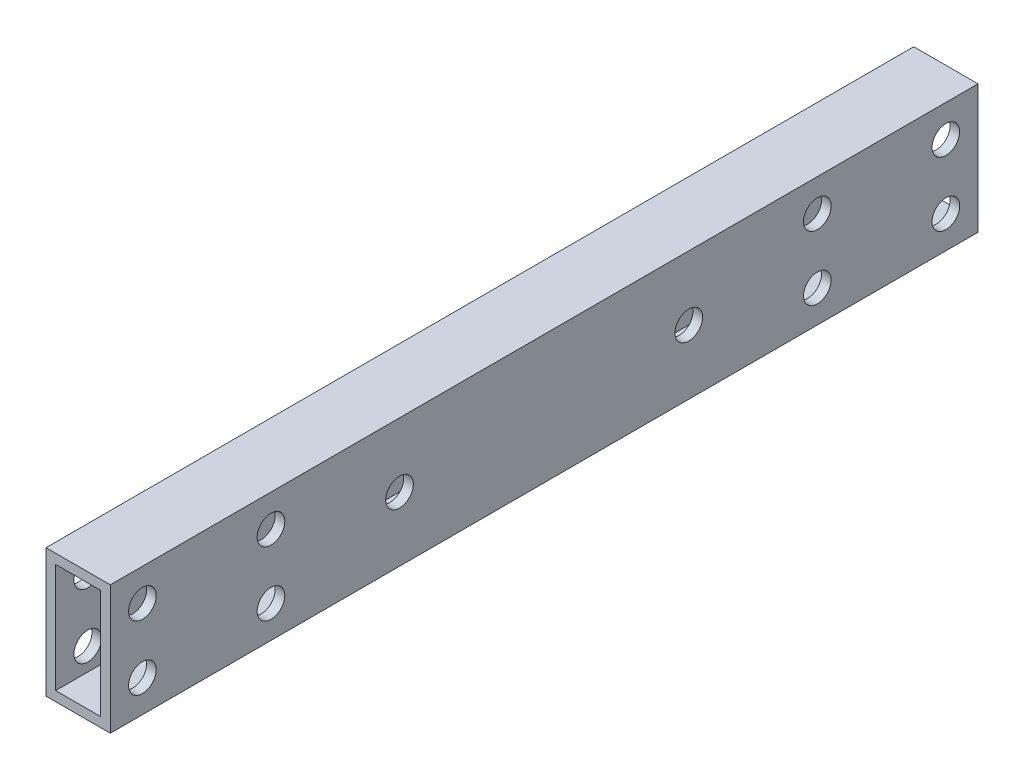
ISO-10303-21;
HEADER;
FILE_DESCRIPTION(('STEP AP214'),'2;1');
FILE_NAME('part.step','',(''),(''),'','','');
FILE_SCHEMA(('AUTOMOTIVE_DESIGN { 1 0 10303 214 1 1 1 1 }'));
ENDSEC;
DATA;
#1=APPLICATION_CONTEXT('core data for automotive mechanical design processes');
#2=APPLICATION_PROTOCOL_DEFINITION('international standard','automotive_design',2000,#1);
#3=PRODUCT_CONTEXT('',#1,'mechanical');
#4=PRODUCT('Part','Part','',(#3));
#5=PRODUCT_RELATED_PRODUCT_CATEGORY('part','',(#4));
#6=PRODUCT_DEFINITION_FORMATION('','',#4);
#7=PRODUCT_DEFINITION_CONTEXT('part definition',#1,'design');
#8=PRODUCT_DEFINITION('design','',#6,#7);
#9=PRODUCT_DEFINITION_SHAPE('','',#8);
#10=(LENGTH_UNIT() NAMED_UNIT(*) SI_UNIT(.MILLI.,.METRE.));
#11=(NAMED_UNIT(*) PLANE_ANGLE_UNIT() SI_UNIT($,.RADIAN.));
#12=(NAMED_UNIT(*) SI_UNIT($,.STERADIAN.) SOLID_ANGLE_UNIT());
#13=UNCERTAINTY_MEASURE_WITH_UNIT(LENGTH_MEASURE(1.E-05),#10,'distance_accuracy_value','');
#14=(GEOMETRIC_REPRESENTATION_CONTEXT(3) GLOBAL_UNCERTAINTY_ASSIGNED_CONTEXT((#13)) GLOBAL_UNIT_ASSIGNED_CONTEXT((#10,
#11,#12)) REPRESENTATION_CONTEXT('',''));
#15=CARTESIAN_POINT('',(0.,0.,0.));
#16=DIRECTION('',(0.,0.,1.));
#17=DIRECTION('',(1.,0.,0.));
#18=AXIS2_PLACEMENT_3D('',#15,#16,#17);
#19=CARTESIAN_POINT('',(0.,0.,135.));
#20=DIRECTION('',(0.,0.,1.));
#21=DIRECTION('',(1.,0.,0.));
#22=AXIS2_PLACEMENT_3D('',#19,#20,#21);
#23=PLANE('',#22);
#24=DIRECTION('',(0.,-1.,0.));
#25=VECTOR('',#24,1.);
#26=CARTESIAN_POINT('',(0.,0.,135.));
#27=LINE('',#26,#25);
#28=CARTESIAN_POINT('',(0.,20.,135.));
#29=VERTEX_POINT('',#28);
#30=CARTESIAN_POINT('',(0.,0.,135.));
#31=VERTEX_POINT('',#30);
#32=EDGE_CURVE('E166',#29,#31,#27,.T.);
#33=ORIENTED_EDGE('',*,*,#32,.T.);
#34=DIRECTION('',(1.,0.,0.));
#35=VECTOR('',#34,1.);
#36=CARTESIAN_POINT('',(0.,0.,135.));
#37=LINE('',#36,#35);
#38=CARTESIAN_POINT('',(10.,0.,135.));
#39=VERTEX_POINT('',#38);
#40=EDGE_CURVE('E169',#31,#39,#37,.T.);
#41=ORIENTED_EDGE('',*,*,#40,.T.);
#42=DIRECTION('',(0.,1.,0.));
#43=VECTOR('',#42,1.);
#44=CARTESIAN_POINT('',(10.,0.,135.));
#45=LINE('',#44,#43);
#46=CARTESIAN_POINT('',(10.,20.,135.));
#47=VERTEX_POINT('',#46);
#48=EDGE_CURVE('E172',#39,#47,#45,.T.);
#49=ORIENTED_EDGE('',*,*,#48,.T.);
#50=DIRECTION('',(-1.,0.,0.));
#51=VECTOR('',#50,1.);
#52=CARTESIAN_POINT('',(0.,20.,135.));
#53=LINE('',#52,#51);
#54=EDGE_CURVE('E174',#47,#29,#53,.T.);
#55=ORIENTED_EDGE('',*,*,#54,.T.);
#56=EDGE_LOOP('',(#33,#41,#49,#55));
#57=FACE_BOUND('',#56,.T.);
#58=DIRECTION('',(1.,0.,0.));
#59=VECTOR('',#58,1.);
#60=CARTESIAN_POINT('',(0.,1.5,135.));
#61=LINE('',#60,#59);
#62=CARTESIAN_POINT('',(1.5,1.5,135.));
#63=VERTEX_POINT('',#62);
#64=CARTESIAN_POINT('',(8.5,1.5,135.));
#65=VERTEX_POINT('',#64);
#66=EDGE_CURVE('E136',#63,#65,#61,.T.);
#67=ORIENTED_EDGE('',*,*,#66,.F.);
#68=DIRECTION('',(0.,-1.,0.));
#69=VECTOR('',#68,1.);
#70=CARTESIAN_POINT('',(1.5,0.,135.));
#71=LINE('',#70,#69);
#72=CARTESIAN_POINT('',(1.5,18.5,135.));
#73=VERTEX_POINT('',#72);
#74=EDGE_CURVE('E128',#73,#63,#71,.T.);
#75=ORIENTED_EDGE('',*,*,#74,.F.);
#76=DIRECTION('',(-1.,0.,0.));
#77=VECTOR('',#76,1.);
#78=CARTESIAN_POINT('',(0.,18.5,135.));
#79=LINE('',#78,#77);
#80=CARTESIAN_POINT('',(8.5,18.5,135.));
#81=VERTEX_POINT('',#80);
#82=EDGE_CURVE('E150',#81,#73,#79,.T.);
#83=ORIENTED_EDGE('',*,*,#82,.F.);
#84=DIRECTION('',(0.,1.,0.));
#85=VECTOR('',#84,1.);
#86=CARTESIAN_POINT('',(8.5,0.,135.));
#87=LINE('',#86,#85);
#88=EDGE_CURVE('E148',#65,#81,#87,.T.);
#89=ORIENTED_EDGE('',*,*,#88,.F.);
#90=EDGE_LOOP('',(#67,#75,#83,#89));
#91=FACE_BOUND('',#90,.T.);
#92=ADVANCED_FACE('F61',(#57,#91),#23,.T.);
#93=CARTESIAN_POINT('',(0.,0.,0.));
#94=DIRECTION('',(0.,0.,1.));
#95=DIRECTION('',(1.,0.,0.));
#96=AXIS2_PLACEMENT_3D('',#93,#94,#95);
#97=PLANE('',#96);
#98=DIRECTION('',(0.,-1.,0.));
#99=VECTOR('',#98,1.);
#100=CARTESIAN_POINT('',(0.,0.,0.));
#101=LINE('',#100,#99);
#102=CARTESIAN_POINT('',(0.,20.,0.));
#103=VERTEX_POINT('',#102);
#104=CARTESIAN_POINT('',(0.,0.,0.));
#105=VERTEX_POINT('',#104);
#106=EDGE_CURVE('E144',#103,#105,#101,.T.);
#107=ORIENTED_EDGE('',*,*,#106,.F.);
#108=DIRECTION('',(-1.,0.,0.));
#109=VECTOR('',#108,1.);
#110=CARTESIAN_POINT('',(0.,20.,0.));
#111=LINE('',#110,#109);
#112=CARTESIAN_POINT('',(10.,20.,0.));
#113=VERTEX_POINT('',#112);
#114=EDGE_CURVE('E170',#113,#103,#111,.T.);
#115=ORIENTED_EDGE('',*,*,#114,.F.);
#116=DIRECTION('',(0.,1.,0.));
#117=VECTOR('',#116,1.);
#118=CARTESIAN_POINT('',(10.,0.,0.));
#119=LINE('',#118,#117);
#120=CARTESIAN_POINT('',(10.,0.,0.));
#121=VERTEX_POINT('',#120);
#122=EDGE_CURVE('E181',#121,#113,#119,.T.);
#123=ORIENTED_EDGE('',*,*,#122,.F.);
#124=DIRECTION('',(1.,0.,0.));
#125=VECTOR('',#124,1.);
#126=CARTESIAN_POINT('',(0.,0.,0.));
#127=LINE('',#126,#125);
#128=EDGE_CURVE('E179',#105,#121,#127,.T.);
#129=ORIENTED_EDGE('',*,*,#128,.F.);
#130=EDGE_LOOP('',(#107,#115,#123,#129));
#131=FACE_BOUND('',#130,.T.);
#132=DIRECTION('',(0.,-1.,0.));
#133=VECTOR('',#132,1.);
#134=CARTESIAN_POINT('',(1.5,0.,0.));
#135=LINE('',#134,#133);
#136=CARTESIAN_POINT('',(1.5,18.5,0.));
#137=VERTEX_POINT('',#136);
#138=CARTESIAN_POINT('',(1.5,1.5,0.));
#139=VERTEX_POINT('',#138);
#140=EDGE_CURVE('E86',#137,#139,#135,.T.);
#141=ORIENTED_EDGE('',*,*,#140,.T.);
#142=DIRECTION('',(1.,0.,0.));
#143=VECTOR('',#142,1.);
#144=CARTESIAN_POINT('',(0.,1.5,0.));
#145=LINE('',#144,#143);
#146=CARTESIAN_POINT('',(8.5,1.5,0.));
#147=VERTEX_POINT('',#146);
#148=EDGE_CURVE('E143',#139,#147,#145,.T.);
#149=ORIENTED_EDGE('',*,*,#148,.T.);
#150=DIRECTION('',(0.,1.,0.));
#151=VECTOR('',#150,1.);
#152=CARTESIAN_POINT('',(8.5,0.,0.));
#153=LINE('',#152,#151);
#154=CARTESIAN_POINT('',(8.5,18.5,0.));
#155=VERTEX_POINT('',#154);
#156=EDGE_CURVE('E158',#147,#155,#153,.T.);
#157=ORIENTED_EDGE('',*,*,#156,.T.);
#158=DIRECTION('',(-1.,0.,0.));
#159=VECTOR('',#158,1.);
#160=CARTESIAN_POINT('',(0.,18.5,0.));
#161=LINE('',#160,#159);
#162=EDGE_CURVE('E137',#155,#137,#161,.T.);
#163=ORIENTED_EDGE('',*,*,#162,.T.);
#164=EDGE_LOOP('',(#141,#149,#157,#163));
#165=FACE_BOUND('',#164,.T.);
#166=ADVANCED_FACE('F269',(#131,#165),#97,.F.);
#167=CARTESIAN_POINT('',(0.,0.,135.));
#168=DIRECTION('',(1.,0.,0.));
#169=DIRECTION('',(0.,0.,-1.));
#170=AXIS2_PLACEMENT_3D('',#167,#168,#169);
#171=PLANE('',#170);
#172=CARTESIAN_POINT('',(0.,5.,130.));
#173=DIRECTION('',(1.,0.,0.));
#174=DIRECTION('',(0.,0.,-1.));
#175=AXIS2_PLACEMENT_3D('',#172,#173,#174);
#176=CIRCLE('',#175,2.15000000000002);
#177=CARTESIAN_POINT('',(0.,5.,127.85));
#178=VERTEX_POINT('',#177);
#179=EDGE_CURVE('E322',#178,#178,#176,.F.);
#180=ORIENTED_EDGE('',*,*,#179,.F.);
#181=EDGE_LOOP('',(#180));
#182=FACE_BOUND('',#181,.T.);
#183=CARTESIAN_POINT('',(0.,5.,110.));
#184=DIRECTION('',(1.,0.,0.));
#185=DIRECTION('',(0.,0.,-1.));
#186=AXIS2_PLACEMENT_3D('',#183,#184,#185);
#187=CIRCLE('',#186,2.15000000000002);
#188=CARTESIAN_POINT('',(0.,5.,107.85));
#189=VERTEX_POINT('',#188);
#190=EDGE_CURVE('E326',#189,#189,#187,.F.);
#191=ORIENTED_EDGE('',*,*,#190,.F.);
#192=EDGE_LOOP('',(#191));
#193=FACE_BOUND('',#192,.T.);
#194=CARTESIAN_POINT('',(0.,15.,5.));
#195=DIRECTION('',(1.,0.,0.));
#196=DIRECTION('',(0.,0.,-1.));
#197=AXIS2_PLACEMENT_3D('',#194,#195,#196);
#198=CIRCLE('',#197,2.15000000000002);
#199=CARTESIAN_POINT('',(0.,15.,2.84999999999999));
#200=VERTEX_POINT('',#199);
#201=EDGE_CURVE('E330',#200,#200,#198,.F.);
#202=ORIENTED_EDGE('',*,*,#201,.F.);
#203=EDGE_LOOP('',(#202));
#204=FACE_BOUND('',#203,.T.);
#205=CARTESIAN_POINT('',(0.,15.,25.));
#206=DIRECTION('',(1.,0.,0.));
#207=DIRECTION('',(0.,0.,-1.));
#208=AXIS2_PLACEMENT_3D('',#205,#206,#207);
#209=CIRCLE('',#208,2.15000000000002);
#210=CARTESIAN_POINT('',(0.,15.,22.85));
#211=VERTEX_POINT('',#210);
#212=EDGE_CURVE('E334',#211,#211,#209,.F.);
#213=ORIENTED_EDGE('',*,*,#212,.F.);
#214=EDGE_LOOP('',(#213));
#215=FACE_BOUND('',#214,.T.);
#216=CARTESIAN_POINT('',(0.,5.00000000000002,25.));
#217=DIRECTION('',(1.,0.,0.));
#218=DIRECTION('',(0.,0.,-1.));
#219=AXIS2_PLACEMENT_3D('',#216,#217,#218);
#220=CIRCLE('',#219,2.15000000000002);
#221=CARTESIAN_POINT('',(0.,5.00000000000002,22.85));
#222=VERTEX_POINT('',#221);
#223=EDGE_CURVE('E338',#222,#222,#220,.F.);
#224=ORIENTED_EDGE('',*,*,#223,.F.);
#225=EDGE_LOOP('',(#224));
#226=FACE_BOUND('',#225,.T.);
#227=CARTESIAN_POINT('',(0.,5.00000000000002,5.));
#228=DIRECTION('',(1.,0.,0.));
#229=DIRECTION('',(0.,0.,-1.));
#230=AXIS2_PLACEMENT_3D('',#227,#228,#229);
#231=CIRCLE('',#230,2.15000000000002);
#232=CARTESIAN_POINT('',(0.,5.00000000000002,2.84999999999999));
#233=VERTEX_POINT('',#232);
#234=EDGE_CURVE('E342',#233,#233,#231,.F.);
#235=ORIENTED_EDGE('',*,*,#234,.F.);
#236=EDGE_LOOP('',(#235));
#237=FACE_BOUND('',#236,.T.);
#238=CARTESIAN_POINT('',(0.,10.,45.));
#239=DIRECTION('',(1.,0.,0.));
#240=DIRECTION('',(0.,0.,-1.));
#241=AXIS2_PLACEMENT_3D('',#238,#239,#240);
#242=CIRCLE('',#241,2.15);
#243=CARTESIAN_POINT('',(0.,10.,42.85));
#244=VERTEX_POINT('',#243);
#245=EDGE_CURVE('E346',#244,#244,#242,.F.);
#246=ORIENTED_EDGE('',*,*,#245,.F.);
#247=EDGE_LOOP('',(#246));
#248=FACE_BOUND('',#247,.T.);
#249=CARTESIAN_POINT('',(0.,15.,110.));
#250=DIRECTION('',(1.,0.,0.));
#251=DIRECTION('',(0.,0.,-1.));
#252=AXIS2_PLACEMENT_3D('',#249,#250,#251);
#253=CIRCLE('',#252,2.15000000000002);
#254=CARTESIAN_POINT('',(0.,15.,107.85));
#255=VERTEX_POINT('',#254);
#256=EDGE_CURVE('E350',#255,#255,#253,.F.);
#257=ORIENTED_EDGE('',*,*,#256,.F.);
#258=EDGE_LOOP('',(#257));
#259=FACE_BOUND('',#258,.T.);
#260=CARTESIAN_POINT('',(0.,9.99999999999999,90.));
#261=DIRECTION('',(1.,0.,0.));
#262=DIRECTION('',(0.,0.,-1.));
#263=AXIS2_PLACEMENT_3D('',#260,#261,#262);
#264=CIRCLE('',#263,2.15);
#265=CARTESIAN_POINT('',(0.,9.99999999999999,87.85));
#266=VERTEX_POINT('',#265);
#267=EDGE_CURVE('E354',#266,#266,#264,.F.);
#268=ORIENTED_EDGE('',*,*,#267,.F.);
#269=EDGE_LOOP('',(#268));
#270=FACE_BOUND('',#269,.T.);
#271=CARTESIAN_POINT('',(0.,15.,130.));
#272=DIRECTION('',(1.,0.,0.));
#273=DIRECTION('',(0.,0.,-1.));
#274=AXIS2_PLACEMENT_3D('',#271,#272,#273);
#275=CIRCLE('',#274,2.15000000000002);
#276=CARTESIAN_POINT('',(0.,15.,127.85));
#277=VERTEX_POINT('',#276);
#278=EDGE_CURVE('E195',#277,#277,#275,.F.);
#279=ORIENTED_EDGE('',*,*,#278,.F.);
#280=EDGE_LOOP('',(#279));
#281=FACE_BOUND('',#280,.T.);
#282=ORIENTED_EDGE('',*,*,#106,.T.);
#283=DIRECTION('',(0.,0.,-1.));
#284=VECTOR('',#283,1.);
#285=CARTESIAN_POINT('',(0.,0.,135.));
#286=LINE('',#285,#284);
#287=EDGE_CURVE('E12',#31,#105,#286,.T.);
#288=ORIENTED_EDGE('',*,*,#287,.F.);
#289=ORIENTED_EDGE('',*,*,#32,.F.);
#290=DIRECTION('',(0.,0.,-1.));
#291=VECTOR('',#290,1.);
#292=CARTESIAN_POINT('',(0.,20.,135.));
#293=LINE('',#292,#291);
#294=EDGE_CURVE('E176',#29,#103,#293,.T.);
#295=ORIENTED_EDGE('',*,*,#294,.T.);
#296=EDGE_LOOP('',(#282,#288,#289,#295));
#297=FACE_BOUND('',#296,.T.);
#298=ADVANCED_FACE('F63',(#182,#193,#204,#215,#226,#237,#248,#259,#270,#281,#297),#171,.F.);
#299=CARTESIAN_POINT('',(0.,0.,135.));
#300=DIRECTION('',(0.,1.,0.));
#301=DIRECTION('',(0.,0.,1.));
#302=AXIS2_PLACEMENT_3D('',#299,#300,#301);
#303=PLANE('',#302);
#304=ORIENTED_EDGE('',*,*,#128,.T.);
#305=DIRECTION('',(0.,0.,-1.));
#306=VECTOR('',#305,1.);
#307=CARTESIAN_POINT('',(10.,0.,135.));
#308=LINE('',#307,#306);
#309=EDGE_CURVE('E70',#39,#121,#308,.T.);
#310=ORIENTED_EDGE('',*,*,#309,.F.);
#311=ORIENTED_EDGE('',*,*,#40,.F.);
#312=ORIENTED_EDGE('',*,*,#287,.T.);
#313=EDGE_LOOP('',(#304,#310,#311,#312));
#314=FACE_BOUND('',#313,.T.);
#315=ADVANCED_FACE('F297',(#314),#303,.F.);
#316=CARTESIAN_POINT('',(10.,0.,135.));
#317=DIRECTION('',(-1.,0.,0.));
#318=DIRECTION('',(0.,0.,1.));
#319=AXIS2_PLACEMENT_3D('',#316,#317,#318);
#320=PLANE('',#319);
#321=CARTESIAN_POINT('',(10.,5.,130.));
#322=DIRECTION('',(1.,0.,0.));
#323=DIRECTION('',(0.,0.,1.));
#324=AXIS2_PLACEMENT_3D('',#321,#322,#323);
#325=CIRCLE('',#324,2.15000000000002);
#326=CARTESIAN_POINT('',(10.,5.,132.15));
#327=VERTEX_POINT('',#326);
#328=EDGE_CURVE('E445',#327,#327,#325,.T.);
#329=ORIENTED_EDGE('',*,*,#328,.F.);
#330=EDGE_LOOP('',(#329));
#331=FACE_BOUND('',#330,.T.);
#332=CARTESIAN_POINT('',(10.,5.,110.));
#333=DIRECTION('',(1.,0.,0.));
#334=DIRECTION('',(0.,0.,1.));
#335=AXIS2_PLACEMENT_3D('',#332,#333,#334);
#336=CIRCLE('',#335,2.15000000000002);
#337=CARTESIAN_POINT('',(10.,5.,112.15));
#338=VERTEX_POINT('',#337);
#339=EDGE_CURVE('E457',#338,#338,#336,.T.);
#340=ORIENTED_EDGE('',*,*,#339,.F.);
#341=EDGE_LOOP('',(#340));
#342=FACE_BOUND('',#341,.T.);
#343=CARTESIAN_POINT('',(10.,15.,5.));
#344=DIRECTION('',(1.,0.,0.));
#345=DIRECTION('',(0.,0.,1.));
#346=AXIS2_PLACEMENT_3D('',#343,#344,#345);
#347=CIRCLE('',#346,2.15000000000002);
#348=CARTESIAN_POINT('',(10.,15.,7.15000000000002));
#349=VERTEX_POINT('',#348);
#350=EDGE_CURVE('E453',#349,#349,#347,.T.);
#351=ORIENTED_EDGE('',*,*,#350,.F.);
#352=EDGE_LOOP('',(#351));
#353=FACE_BOUND('',#352,.T.);
#354=CARTESIAN_POINT('',(10.,15.,25.));
#355=DIRECTION('',(1.,0.,0.));
#356=DIRECTION('',(0.,0.,1.));
#357=AXIS2_PLACEMENT_3D('',#354,#355,#356);
#358=CIRCLE('',#357,2.15000000000002);
#359=CARTESIAN_POINT('',(10.,15.,27.15));
#360=VERTEX_POINT('',#359);
#361=EDGE_CURVE('E448',#360,#360,#358,.T.);
#362=ORIENTED_EDGE('',*,*,#361,.F.);
#363=EDGE_LOOP('',(#362));
#364=FACE_BOUND('',#363,.T.);
#365=CARTESIAN_POINT('',(10.,5.00000000000002,25.));
#366=DIRECTION('',(1.,0.,0.));
#367=DIRECTION('',(0.,0.,-1.));
#368=AXIS2_PLACEMENT_3D('',#365,#366,#367);
#369=CIRCLE('',#368,2.15000000000002);
#370=CARTESIAN_POINT('',(10.,5.00000000000002,22.85));
#371=VERTEX_POINT('',#370);
#372=EDGE_CURVE('E452',#371,#371,#369,.T.);
#373=ORIENTED_EDGE('',*,*,#372,.F.);
#374=EDGE_LOOP('',(#373));
#375=FACE_BOUND('',#374,.T.);
#376=CARTESIAN_POINT('',(10.,5.00000000000002,5.));
#377=DIRECTION('',(1.,0.,0.));
#378=DIRECTION('',(0.,0.,-1.));
#379=AXIS2_PLACEMENT_3D('',#376,#377,#378);
#380=CIRCLE('',#379,2.15000000000002);
#381=CARTESIAN_POINT('',(10.,5.00000000000002,2.84999999999999));
#382=VERTEX_POINT('',#381);
#383=EDGE_CURVE('E472',#382,#382,#380,.T.);
#384=ORIENTED_EDGE('',*,*,#383,.F.);
#385=EDGE_LOOP('',(#384));
#386=FACE_BOUND('',#385,.T.);
#387=CARTESIAN_POINT('',(10.,10.,45.));
#388=DIRECTION('',(1.,0.,0.));
#389=DIRECTION('',(0.,0.,-1.));
#390=AXIS2_PLACEMENT_3D('',#387,#388,#389);
#391=CIRCLE('',#390,2.15);
#392=CARTESIAN_POINT('',(10.,10.,42.85));
#393=VERTEX_POINT('',#392);
#394=EDGE_CURVE('E468',#393,#393,#391,.T.);
#395=ORIENTED_EDGE('',*,*,#394,.F.);
#396=EDGE_LOOP('',(#395));
#397=FACE_BOUND('',#396,.T.);
#398=CARTESIAN_POINT('',(10.,15.,110.));
#399=DIRECTION('',(1.,0.,0.));
#400=DIRECTION('',(0.,0.,-1.));
#401=AXIS2_PLACEMENT_3D('',#398,#399,#400);
#402=CIRCLE('',#401,2.15000000000002);
#403=CARTESIAN_POINT('',(10.,15.,107.85));
#404=VERTEX_POINT('',#403);
#405=EDGE_CURVE('E464',#404,#404,#402,.T.);
#406=ORIENTED_EDGE('',*,*,#405,.F.);
#407=EDGE_LOOP('',(#406));
#408=FACE_BOUND('',#407,.T.);
#409=CARTESIAN_POINT('',(10.,9.99999999999999,90.));
#410=DIRECTION('',(1.,0.,0.));
#411=DIRECTION('',(0.,0.,1.));
#412=AXIS2_PLACEMENT_3D('',#409,#410,#411);
#413=CIRCLE('',#412,2.15);
#414=CARTESIAN_POINT('',(10.,9.99999999999999,92.15));
#415=VERTEX_POINT('',#414);
#416=EDGE_CURVE('E442',#415,#415,#413,.T.);
#417=ORIENTED_EDGE('',*,*,#416,.F.);
#418=EDGE_LOOP('',(#417));
#419=FACE_BOUND('',#418,.T.);
#420=CARTESIAN_POINT('',(10.,15.,130.));
#421=DIRECTION('',(1.,0.,0.));
#422=DIRECTION('',(0.,0.,-1.));
#423=AXIS2_PLACEMENT_3D('',#420,#421,#422);
#424=CIRCLE('',#423,2.15000000000002);
#425=CARTESIAN_POINT('',(10.,15.,127.85));
#426=VERTEX_POINT('',#425);
#427=EDGE_CURVE('E358',#426,#426,#424,.T.);
#428=ORIENTED_EDGE('',*,*,#427,.F.);
#429=EDGE_LOOP('',(#428));
#430=FACE_BOUND('',#429,.T.);
#431=ORIENTED_EDGE('',*,*,#122,.T.);
#432=DIRECTION('',(0.,0.,-1.));
#433=VECTOR('',#432,1.);
#434=CARTESIAN_POINT('',(10.,20.,135.));
#435=LINE('',#434,#433);
#436=EDGE_CURVE('E186',#47,#113,#435,.T.);
#437=ORIENTED_EDGE('',*,*,#436,.F.);
#438=ORIENTED_EDGE('',*,*,#48,.F.);
#439=ORIENTED_EDGE('',*,*,#309,.T.);
#440=EDGE_LOOP('',(#431,#437,#438,#439));
#441=FACE_BOUND('',#440,.T.);
#442=ADVANCED_FACE('F294',(#331,#342,#353,#364,#375,#386,#397,#408,#419,#430,#441),#320,.F.);
#443=CARTESIAN_POINT('',(0.,20.,135.));
#444=DIRECTION('',(0.,-1.,0.));
#445=DIRECTION('',(0.,0.,-1.));
#446=AXIS2_PLACEMENT_3D('',#443,#444,#445);
#447=PLANE('',#446);
#448=ORIENTED_EDGE('',*,*,#114,.T.);
#449=ORIENTED_EDGE('',*,*,#294,.F.);
#450=ORIENTED_EDGE('',*,*,#54,.F.);
#451=ORIENTED_EDGE('',*,*,#436,.T.);
#452=EDGE_LOOP('',(#448,#449,#450,#451));
#453=FACE_BOUND('',#452,.T.);
#454=ADVANCED_FACE('F291',(#453),#447,.F.);
#455=CARTESIAN_POINT('',(1.5,0.,135.));
#456=DIRECTION('',(1.,0.,0.));
#457=DIRECTION('',(0.,0.,-1.));
#458=AXIS2_PLACEMENT_3D('',#455,#456,#457);
#459=PLANE('',#458);
#460=CARTESIAN_POINT('',(1.5,5.,130.));
#461=DIRECTION('',(1.,0.,0.));
#462=DIRECTION('',(0.,0.,-1.));
#463=AXIS2_PLACEMENT_3D('',#460,#461,#462);
#464=CIRCLE('',#463,2.15000000000002);
#465=CARTESIAN_POINT('',(1.5,5.,127.85));
#466=VERTEX_POINT('',#465);
#467=EDGE_CURVE('E156',#466,#466,#464,.T.);
#468=ORIENTED_EDGE('',*,*,#467,.F.);
#469=EDGE_LOOP('',(#468));
#470=FACE_BOUND('',#469,.T.);
#471=CARTESIAN_POINT('',(1.5,5.,110.));
#472=DIRECTION('',(1.,0.,0.));
#473=DIRECTION('',(0.,0.,-1.));
#474=AXIS2_PLACEMENT_3D('',#471,#472,#473);
#475=CIRCLE('',#474,2.15000000000002);
#476=CARTESIAN_POINT('',(1.5,5.,107.85));
#477=VERTEX_POINT('',#476);
#478=EDGE_CURVE('E225',#477,#477,#475,.T.);
#479=ORIENTED_EDGE('',*,*,#478,.F.);
#480=EDGE_LOOP('',(#479));
#481=FACE_BOUND('',#480,.T.);
#482=CARTESIAN_POINT('',(1.5,15.,5.));
#483=DIRECTION('',(1.,0.,0.));
#484=DIRECTION('',(0.,0.,-1.));
#485=AXIS2_PLACEMENT_3D('',#482,#483,#484);
#486=CIRCLE('',#485,2.15000000000002);
#487=CARTESIAN_POINT('',(1.5,15.,2.84999999999999));
#488=VERTEX_POINT('',#487);
#489=EDGE_CURVE('E222',#488,#488,#486,.T.);
#490=ORIENTED_EDGE('',*,*,#489,.F.);
#491=EDGE_LOOP('',(#490));
#492=FACE_BOUND('',#491,.T.);
#493=CARTESIAN_POINT('',(1.5,15.,25.));
#494=DIRECTION('',(1.,0.,0.));
#495=DIRECTION('',(0.,0.,-1.));
#496=AXIS2_PLACEMENT_3D('',#493,#494,#495);
#497=CIRCLE('',#496,2.15000000000002);
#498=CARTESIAN_POINT('',(1.5,15.,22.85));
#499=VERTEX_POINT('',#498);
#500=EDGE_CURVE('E219',#499,#499,#497,.T.);
#501=ORIENTED_EDGE('',*,*,#500,.F.);
#502=EDGE_LOOP('',(#501));
#503=FACE_BOUND('',#502,.T.);
#504=CARTESIAN_POINT('',(1.5,5.00000000000002,25.));
#505=DIRECTION('',(1.,0.,0.));
#506=DIRECTION('',(0.,0.,-1.));
#507=AXIS2_PLACEMENT_3D('',#504,#505,#506);
#508=CIRCLE('',#507,2.15000000000002);
#509=CARTESIAN_POINT('',(1.5,5.00000000000002,22.85));
#510=VERTEX_POINT('',#509);
#511=EDGE_CURVE('E215',#510,#510,#508,.T.);
#512=ORIENTED_EDGE('',*,*,#511,.F.);
#513=EDGE_LOOP('',(#512));
#514=FACE_BOUND('',#513,.T.);
#515=CARTESIAN_POINT('',(1.5,5.00000000000002,5.));
#516=DIRECTION('',(1.,0.,0.));
#517=DIRECTION('',(0.,0.,-1.));
#518=AXIS2_PLACEMENT_3D('',#515,#516,#517);
#519=CIRCLE('',#518,2.15000000000002);
#520=CARTESIAN_POINT('',(1.5,5.00000000000002,2.84999999999999));
#521=VERTEX_POINT('',#520);
#522=EDGE_CURVE('E211',#521,#521,#519,.T.);
#523=ORIENTED_EDGE('',*,*,#522,.F.);
#524=EDGE_LOOP('',(#523));
#525=FACE_BOUND('',#524,.T.);
#526=CARTESIAN_POINT('',(1.5,10.,45.));
#527=DIRECTION('',(1.,0.,0.));
#528=DIRECTION('',(0.,0.,-1.));
#529=AXIS2_PLACEMENT_3D('',#526,#527,#528);
#530=CIRCLE('',#529,2.15);
#531=CARTESIAN_POINT('',(1.5,10.,42.85));
#532=VERTEX_POINT('',#531);
#533=EDGE_CURVE('E207',#532,#532,#530,.T.);
#534=ORIENTED_EDGE('',*,*,#533,.F.);
#535=EDGE_LOOP('',(#534));
#536=FACE_BOUND('',#535,.T.);
#537=CARTESIAN_POINT('',(1.5,15.,110.));
#538=DIRECTION('',(1.,0.,0.));
#539=DIRECTION('',(0.,0.,-1.));
#540=AXIS2_PLACEMENT_3D('',#537,#538,#539);
#541=CIRCLE('',#540,2.15000000000002);
#542=CARTESIAN_POINT('',(1.5,15.,107.85));
#543=VERTEX_POINT('',#542);
#544=EDGE_CURVE('E203',#543,#543,#541,.T.);
#545=ORIENTED_EDGE('',*,*,#544,.F.);
#546=EDGE_LOOP('',(#545));
#547=FACE_BOUND('',#546,.T.);
#548=CARTESIAN_POINT('',(1.5,9.99999999999999,90.));
#549=DIRECTION('',(1.,0.,0.));
#550=DIRECTION('',(0.,0.,-1.));
#551=AXIS2_PLACEMENT_3D('',#548,#549,#550);
#552=CIRCLE('',#551,2.15);
#553=CARTESIAN_POINT('',(1.5,9.99999999999999,87.85));
#554=VERTEX_POINT('',#553);
#555=EDGE_CURVE('E199',#554,#554,#552,.T.);
#556=ORIENTED_EDGE('',*,*,#555,.F.);
#557=EDGE_LOOP('',(#556));
#558=FACE_BOUND('',#557,.T.);
#559=CARTESIAN_POINT('',(1.5,15.,130.));
#560=DIRECTION('',(1.,0.,0.));
#561=DIRECTION('',(0.,0.,-1.));
#562=AXIS2_PLACEMENT_3D('',#559,#560,#561);
#563=CIRCLE('',#562,2.15000000000002);
#564=CARTESIAN_POINT('',(1.5,15.,127.85));
#565=VERTEX_POINT('',#564);
#566=EDGE_CURVE('E194',#565,#565,#563,.T.);
#567=ORIENTED_EDGE('',*,*,#566,.F.);
#568=EDGE_LOOP('',(#567));
#569=FACE_BOUND('',#568,.T.);
#570=ORIENTED_EDGE('',*,*,#140,.F.);
#571=DIRECTION('',(0.,0.,-1.));
#572=VECTOR('',#571,1.);
#573=CARTESIAN_POINT('',(1.5,18.5,135.));
#574=LINE('',#573,#572);
#575=EDGE_CURVE('E132',#73,#137,#574,.T.);
#576=ORIENTED_EDGE('',*,*,#575,.F.);
#577=ORIENTED_EDGE('',*,*,#74,.T.);
#578=DIRECTION('',(0.,0.,-1.));
#579=VECTOR('',#578,1.);
#580=CARTESIAN_POINT('',(1.5,1.5,135.));
#581=LINE('',#580,#579);
#582=EDGE_CURVE('E131',#63,#139,#581,.T.);
#583=ORIENTED_EDGE('',*,*,#582,.T.);
#584=EDGE_LOOP('',(#570,#576,#577,#583));
#585=FACE_BOUND('',#584,.T.);
#586=ADVANCED_FACE('F130',(#470,#481,#492,#503,#514,#525,#536,#547,#558,#569,#585),#459,.T.);
#587=CARTESIAN_POINT('',(0.,1.5,135.));
#588=DIRECTION('',(0.,1.,0.));
#589=DIRECTION('',(0.,0.,1.));
#590=AXIS2_PLACEMENT_3D('',#587,#588,#589);
#591=PLANE('',#590);
#592=ORIENTED_EDGE('',*,*,#148,.F.);
#593=ORIENTED_EDGE('',*,*,#582,.F.);
#594=ORIENTED_EDGE('',*,*,#66,.T.);
#595=DIRECTION('',(0.,0.,-1.));
#596=VECTOR('',#595,1.);
#597=CARTESIAN_POINT('',(8.5,1.5,135.));
#598=LINE('',#597,#596);
#599=EDGE_CURVE('E145',#65,#147,#598,.T.);
#600=ORIENTED_EDGE('',*,*,#599,.T.);
#601=EDGE_LOOP('',(#592,#593,#594,#600));
#602=FACE_BOUND('',#601,.T.);
#603=ADVANCED_FACE('F140',(#602),#591,.T.);
#604=CARTESIAN_POINT('',(8.5,0.,135.));
#605=DIRECTION('',(-1.,0.,0.));
#606=DIRECTION('',(0.,0.,1.));
#607=AXIS2_PLACEMENT_3D('',#604,#605,#606);
#608=PLANE('',#607);
#609=CARTESIAN_POINT('',(8.5,5.,130.));
#610=DIRECTION('',(-1.,0.,0.));
#611=DIRECTION('',(0.,0.,1.));
#612=AXIS2_PLACEMENT_3D('',#609,#610,#611);
#613=CIRCLE('',#612,2.15000000000002);
#614=CARTESIAN_POINT('',(8.5,5.,132.15));
#615=VERTEX_POINT('',#614);
#616=EDGE_CURVE('E65',#615,#615,#613,.T.);
#617=ORIENTED_EDGE('',*,*,#616,.F.);
#618=EDGE_LOOP('',(#617));
#619=FACE_BOUND('',#618,.T.);
#620=CARTESIAN_POINT('',(8.5,5.,110.));
#621=DIRECTION('',(-1.,0.,0.));
#622=DIRECTION('',(0.,0.,1.));
#623=AXIS2_PLACEMENT_3D('',#620,#621,#622);
#624=CIRCLE('',#623,2.15000000000002);
#625=CARTESIAN_POINT('',(8.5,5.,112.15));
#626=VERTEX_POINT('',#625);
#627=EDGE_CURVE('E223',#626,#626,#624,.T.);
#628=ORIENTED_EDGE('',*,*,#627,.F.);
#629=EDGE_LOOP('',(#628));
#630=FACE_BOUND('',#629,.T.);
#631=CARTESIAN_POINT('',(8.5,15.,5.));
#632=DIRECTION('',(-1.,0.,0.));
#633=DIRECTION('',(0.,0.,1.));
#634=AXIS2_PLACEMENT_3D('',#631,#632,#633);
#635=CIRCLE('',#634,2.15000000000002);
#636=CARTESIAN_POINT('',(8.5,15.,7.15000000000002));
#637=VERTEX_POINT('',#636);
#638=EDGE_CURVE('E220',#637,#637,#635,.T.);
#639=ORIENTED_EDGE('',*,*,#638,.F.);
#640=EDGE_LOOP('',(#639));
#641=FACE_BOUND('',#640,.T.);
#642=CARTESIAN_POINT('',(8.5,15.,25.));
#643=DIRECTION('',(-1.,0.,0.));
#644=DIRECTION('',(0.,0.,1.));
#645=AXIS2_PLACEMENT_3D('',#642,#643,#644);
#646=CIRCLE('',#645,2.15000000000002);
#647=CARTESIAN_POINT('',(8.5,15.,27.15));
#648=VERTEX_POINT('',#647);
#649=EDGE_CURVE('E216',#648,#648,#646,.T.);
#650=ORIENTED_EDGE('',*,*,#649,.F.);
#651=EDGE_LOOP('',(#650));
#652=FACE_BOUND('',#651,.T.);
#653=CARTESIAN_POINT('',(8.5,5.00000000000002,25.));
#654=DIRECTION('',(-1.,0.,0.));
#655=DIRECTION('',(0.,0.,1.));
#656=AXIS2_PLACEMENT_3D('',#653,#654,#655);
#657=CIRCLE('',#656,2.15000000000002);
#658=CARTESIAN_POINT('',(8.5,5.00000000000002,27.15));
#659=VERTEX_POINT('',#658);
#660=EDGE_CURVE('E212',#659,#659,#657,.T.);
#661=ORIENTED_EDGE('',*,*,#660,.F.);
#662=EDGE_LOOP('',(#661));
#663=FACE_BOUND('',#662,.T.);
#664=CARTESIAN_POINT('',(8.5,5.00000000000002,5.));
#665=DIRECTION('',(-1.,0.,0.));
#666=DIRECTION('',(0.,0.,1.));
#667=AXIS2_PLACEMENT_3D('',#664,#665,#666);
#668=CIRCLE('',#667,2.15000000000002);
#669=CARTESIAN_POINT('',(8.5,5.00000000000002,7.15000000000002));
#670=VERTEX_POINT('',#669);
#671=EDGE_CURVE('E208',#670,#670,#668,.T.);
#672=ORIENTED_EDGE('',*,*,#671,.F.);
#673=EDGE_LOOP('',(#672));
#674=FACE_BOUND('',#673,.T.);
#675=CARTESIAN_POINT('',(8.5,10.,45.));
#676=DIRECTION('',(-1.,0.,0.));
#677=DIRECTION('',(0.,0.,1.));
#678=AXIS2_PLACEMENT_3D('',#675,#676,#677);
#679=CIRCLE('',#678,2.15);
#680=CARTESIAN_POINT('',(8.5,10.,47.15));
#681=VERTEX_POINT('',#680);
#682=EDGE_CURVE('E204',#681,#681,#679,.T.);
#683=ORIENTED_EDGE('',*,*,#682,.F.);
#684=EDGE_LOOP('',(#683));
#685=FACE_BOUND('',#684,.T.);
#686=CARTESIAN_POINT('',(8.5,15.,110.));
#687=DIRECTION('',(-1.,0.,0.));
#688=DIRECTION('',(0.,0.,1.));
#689=AXIS2_PLACEMENT_3D('',#686,#687,#688);
#690=CIRCLE('',#689,2.15000000000002);
#691=CARTESIAN_POINT('',(8.5,15.,112.15));
#692=VERTEX_POINT('',#691);
#693=EDGE_CURVE('E200',#692,#692,#690,.T.);
#694=ORIENTED_EDGE('',*,*,#693,.F.);
#695=EDGE_LOOP('',(#694));
#696=FACE_BOUND('',#695,.T.);
#697=CARTESIAN_POINT('',(8.5,9.99999999999999,90.));
#698=DIRECTION('',(-1.,0.,0.));
#699=DIRECTION('',(0.,0.,1.));
#700=AXIS2_PLACEMENT_3D('',#697,#698,#699);
#701=CIRCLE('',#700,2.15);
#702=CARTESIAN_POINT('',(8.5,9.99999999999999,92.15));
#703=VERTEX_POINT('',#702);
#704=EDGE_CURVE('E196',#703,#703,#701,.T.);
#705=ORIENTED_EDGE('',*,*,#704,.F.);
#706=EDGE_LOOP('',(#705));
#707=FACE_BOUND('',#706,.T.);
#708=CARTESIAN_POINT('',(8.5,15.,130.));
#709=DIRECTION('',(-1.,0.,0.));
#710=DIRECTION('',(0.,0.,1.));
#711=AXIS2_PLACEMENT_3D('',#708,#709,#710);
#712=CIRCLE('',#711,2.15000000000002);
#713=CARTESIAN_POINT('',(8.5,15.,132.15));
#714=VERTEX_POINT('',#713);
#715=EDGE_CURVE('E191',#714,#714,#712,.T.);
#716=ORIENTED_EDGE('',*,*,#715,.F.);
#717=EDGE_LOOP('',(#716));
#718=FACE_BOUND('',#717,.T.);
#719=ORIENTED_EDGE('',*,*,#156,.F.);
#720=ORIENTED_EDGE('',*,*,#599,.F.);
#721=ORIENTED_EDGE('',*,*,#88,.T.);
#722=DIRECTION('',(0.,0.,-1.));
#723=VECTOR('',#722,1.);
#724=CARTESIAN_POINT('',(8.5,18.5,135.));
#725=LINE('',#724,#723);
#726=EDGE_CURVE('E78',#81,#155,#725,.T.);
#727=ORIENTED_EDGE('',*,*,#726,.T.);
#728=EDGE_LOOP('',(#719,#720,#721,#727));
#729=FACE_BOUND('',#728,.T.);
#730=ADVANCED_FACE('F245',(#619,#630,#641,#652,#663,#674,#685,#696,#707,#718,#729),#608,.T.);
#731=CARTESIAN_POINT('',(0.,18.5,135.));
#732=DIRECTION('',(0.,-1.,0.));
#733=DIRECTION('',(0.,0.,-1.));
#734=AXIS2_PLACEMENT_3D('',#731,#732,#733);
#735=PLANE('',#734);
#736=ORIENTED_EDGE('',*,*,#162,.F.);
#737=ORIENTED_EDGE('',*,*,#726,.F.);
#738=ORIENTED_EDGE('',*,*,#82,.T.);
#739=ORIENTED_EDGE('',*,*,#575,.T.);
#740=EDGE_LOOP('',(#736,#737,#738,#739));
#741=FACE_BOUND('',#740,.T.);
#742=ADVANCED_FACE('F248',(#741),#735,.T.);
#743=CARTESIAN_POINT('',(-6.08111831820436,15.,130.));
#744=DIRECTION('',(1.,0.,0.));
#745=DIRECTION('',(0.,0.,-1.));
#746=AXIS2_PLACEMENT_3D('',#743,#744,#745);
#747=CYLINDRICAL_SURFACE('',#746,2.15000000000002);
#748=ORIENTED_EDGE('',*,*,#715,.T.);
#749=EDGE_LOOP('',(#748));
#750=FACE_BOUND('',#749,.T.);
#751=ORIENTED_EDGE('',*,*,#427,.T.);
#752=EDGE_LOOP('',(#751));
#753=FACE_BOUND('',#752,.T.);
#754=ADVANCED_FACE('F271',(#750,#753),#747,.F.);
#755=CARTESIAN_POINT('',(-6.08111831820436,9.99999999999999,90.));
#756=DIRECTION('',(1.,0.,0.));
#757=DIRECTION('',(0.,0.,-1.));
#758=AXIS2_PLACEMENT_3D('',#755,#756,#757);
#759=CYLINDRICAL_SURFACE('',#758,2.15);
#760=ORIENTED_EDGE('',*,*,#704,.T.);
#761=EDGE_LOOP('',(#760));
#762=FACE_BOUND('',#761,.T.);
#763=ORIENTED_EDGE('',*,*,#416,.T.);
#764=EDGE_LOOP('',(#763));
#765=FACE_BOUND('',#764,.T.);
#766=ADVANCED_FACE('F276',(#762,#765),#759,.F.);
#767=CARTESIAN_POINT('',(-6.08111831820436,15.,110.));
#768=DIRECTION('',(1.,0.,0.));
#769=DIRECTION('',(0.,0.,-1.));
#770=AXIS2_PLACEMENT_3D('',#767,#768,#769);
#771=CYLINDRICAL_SURFACE('',#770,2.15000000000002);
#772=ORIENTED_EDGE('',*,*,#693,.T.);
#773=EDGE_LOOP('',(#772));
#774=FACE_BOUND('',#773,.T.);
#775=ORIENTED_EDGE('',*,*,#405,.T.);
#776=EDGE_LOOP('',(#775));
#777=FACE_BOUND('',#776,.T.);
#778=ADVANCED_FACE('F418',(#774,#777),#771,.F.);
#779=CARTESIAN_POINT('',(-6.08111831820436,10.,45.));
#780=DIRECTION('',(1.,0.,0.));
#781=DIRECTION('',(0.,0.,-1.));
#782=AXIS2_PLACEMENT_3D('',#779,#780,#781);
#783=CYLINDRICAL_SURFACE('',#782,2.15);
#784=ORIENTED_EDGE('',*,*,#682,.T.);
#785=EDGE_LOOP('',(#784));
#786=FACE_BOUND('',#785,.T.);
#787=ORIENTED_EDGE('',*,*,#394,.T.);
#788=EDGE_LOOP('',(#787));
#789=FACE_BOUND('',#788,.T.);
#790=ADVANCED_FACE('F413',(#786,#789),#783,.F.);
#791=CARTESIAN_POINT('',(-6.08111831820436,5.00000000000002,5.));
#792=DIRECTION('',(1.,0.,0.));
#793=DIRECTION('',(0.,0.,-1.));
#794=AXIS2_PLACEMENT_3D('',#791,#792,#793);
#795=CYLINDRICAL_SURFACE('',#794,2.15000000000002);
#796=ORIENTED_EDGE('',*,*,#671,.T.);
#797=EDGE_LOOP('',(#796));
#798=FACE_BOUND('',#797,.T.);
#799=ORIENTED_EDGE('',*,*,#383,.T.);
#800=EDGE_LOOP('',(#799));
#801=FACE_BOUND('',#800,.T.);
#802=ADVANCED_FACE('F409',(#798,#801),#795,.F.);
#803=CARTESIAN_POINT('',(-6.08111831820436,5.00000000000002,25.));
#804=DIRECTION('',(1.,0.,0.));
#805=DIRECTION('',(0.,0.,-1.));
#806=AXIS2_PLACEMENT_3D('',#803,#804,#805);
#807=CYLINDRICAL_SURFACE('',#806,2.15000000000002);
#808=ORIENTED_EDGE('',*,*,#660,.T.);
#809=EDGE_LOOP('',(#808));
#810=FACE_BOUND('',#809,.T.);
#811=ORIENTED_EDGE('',*,*,#372,.T.);
#812=EDGE_LOOP('',(#811));
#813=FACE_BOUND('',#812,.T.);
#814=ADVANCED_FACE('F405',(#810,#813),#807,.F.);
#815=CARTESIAN_POINT('',(-6.08111831820436,15.,25.));
#816=DIRECTION('',(1.,0.,0.));
#817=DIRECTION('',(0.,0.,-1.));
#818=AXIS2_PLACEMENT_3D('',#815,#816,#817);
#819=CYLINDRICAL_SURFACE('',#818,2.15000000000002);
#820=ORIENTED_EDGE('',*,*,#649,.T.);
#821=EDGE_LOOP('',(#820));
#822=FACE_BOUND('',#821,.T.);
#823=ORIENTED_EDGE('',*,*,#361,.T.);
#824=EDGE_LOOP('',(#823));
#825=FACE_BOUND('',#824,.T.);
#826=ADVANCED_FACE('F408',(#822,#825),#819,.F.);
#827=CARTESIAN_POINT('',(-6.08111831820436,15.,5.));
#828=DIRECTION('',(1.,0.,0.));
#829=DIRECTION('',(0.,0.,-1.));
#830=AXIS2_PLACEMENT_3D('',#827,#828,#829);
#831=CYLINDRICAL_SURFACE('',#830,2.15000000000002);
#832=ORIENTED_EDGE('',*,*,#638,.T.);
#833=EDGE_LOOP('',(#832));
#834=FACE_BOUND('',#833,.T.);
#835=ORIENTED_EDGE('',*,*,#350,.T.);
#836=EDGE_LOOP('',(#835));
#837=FACE_BOUND('',#836,.T.);
#838=ADVANCED_FACE('F426',(#834,#837),#831,.F.);
#839=CARTESIAN_POINT('',(-6.08111831820436,5.,110.));
#840=DIRECTION('',(1.,0.,0.));
#841=DIRECTION('',(0.,0.,-1.));
#842=AXIS2_PLACEMENT_3D('',#839,#840,#841);
#843=CYLINDRICAL_SURFACE('',#842,2.15000000000002);
#844=ORIENTED_EDGE('',*,*,#627,.T.);
#845=EDGE_LOOP('',(#844));
#846=FACE_BOUND('',#845,.T.);
#847=ORIENTED_EDGE('',*,*,#339,.T.);
#848=EDGE_LOOP('',(#847));
#849=FACE_BOUND('',#848,.T.);
#850=ADVANCED_FACE('F401',(#846,#849),#843,.F.);
#851=CARTESIAN_POINT('',(-6.08111831820436,5.,130.));
#852=DIRECTION('',(1.,0.,0.));
#853=DIRECTION('',(0.,0.,-1.));
#854=AXIS2_PLACEMENT_3D('',#851,#852,#853);
#855=CYLINDRICAL_SURFACE('',#854,2.15000000000002);
#856=ORIENTED_EDGE('',*,*,#616,.T.);
#857=EDGE_LOOP('',(#856));
#858=FACE_BOUND('',#857,.T.);
#859=ORIENTED_EDGE('',*,*,#328,.T.);
#860=EDGE_LOOP('',(#859));
#861=FACE_BOUND('',#860,.T.);
#862=ADVANCED_FACE('F242',(#858,#861),#855,.F.);
#863=ORIENTED_EDGE('',*,*,#566,.T.);
#864=EDGE_LOOP('',(#863));
#865=FACE_BOUND('',#864,.T.);
#866=ORIENTED_EDGE('',*,*,#278,.T.);
#867=EDGE_LOOP('',(#866));
#868=FACE_BOUND('',#867,.T.);
#869=ADVANCED_FACE('F279',(#865,#868),#747,.F.);
#870=ORIENTED_EDGE('',*,*,#555,.T.);
#871=EDGE_LOOP('',(#870));
#872=FACE_BOUND('',#871,.T.);
#873=ORIENTED_EDGE('',*,*,#267,.T.);
#874=EDGE_LOOP('',(#873));
#875=FACE_BOUND('',#874,.T.);
#876=ADVANCED_FACE('F393',(#872,#875),#759,.F.);
#877=ORIENTED_EDGE('',*,*,#544,.T.);
#878=EDGE_LOOP('',(#877));
#879=FACE_BOUND('',#878,.T.);
#880=ORIENTED_EDGE('',*,*,#256,.T.);
#881=EDGE_LOOP('',(#880));
#882=FACE_BOUND('',#881,.T.);
#883=ADVANCED_FACE('F398',(#879,#882),#771,.F.);
#884=ORIENTED_EDGE('',*,*,#533,.T.);
#885=EDGE_LOOP('',(#884));
#886=FACE_BOUND('',#885,.T.);
#887=ORIENTED_EDGE('',*,*,#245,.T.);
#888=EDGE_LOOP('',(#887));
#889=FACE_BOUND('',#888,.T.);
#890=ADVANCED_FACE('F420',(#886,#889),#783,.F.);
#891=ORIENTED_EDGE('',*,*,#522,.T.);
#892=EDGE_LOOP('',(#891));
#893=FACE_BOUND('',#892,.T.);
#894=ORIENTED_EDGE('',*,*,#234,.T.);
#895=EDGE_LOOP('',(#894));
#896=FACE_BOUND('',#895,.T.);
#897=ADVANCED_FACE('F415',(#893,#896),#795,.F.);
#898=ORIENTED_EDGE('',*,*,#511,.T.);
#899=EDGE_LOOP('',(#898));
#900=FACE_BOUND('',#899,.T.);
#901=ORIENTED_EDGE('',*,*,#223,.T.);
#902=EDGE_LOOP('',(#901));
#903=FACE_BOUND('',#902,.T.);
#904=ADVANCED_FACE('F376',(#900,#903),#807,.F.);
#905=ORIENTED_EDGE('',*,*,#500,.T.);
#906=EDGE_LOOP('',(#905));
#907=FACE_BOUND('',#906,.T.);
#908=ORIENTED_EDGE('',*,*,#212,.T.);
#909=EDGE_LOOP('',(#908));
#910=FACE_BOUND('',#909,.T.);
#911=ADVANCED_FACE('F434',(#907,#910),#819,.F.);
#912=ORIENTED_EDGE('',*,*,#489,.T.);
#913=EDGE_LOOP('',(#912));
#914=FACE_BOUND('',#913,.T.);
#915=ORIENTED_EDGE('',*,*,#201,.T.);
#916=EDGE_LOOP('',(#915));
#917=FACE_BOUND('',#916,.T.);
#918=ADVANCED_FACE('F431',(#914,#917),#831,.F.);
#919=ORIENTED_EDGE('',*,*,#478,.T.);
#920=EDGE_LOOP('',(#919));
#921=FACE_BOUND('',#920,.T.);
#922=ORIENTED_EDGE('',*,*,#190,.T.);
#923=EDGE_LOOP('',(#922));
#924=FACE_BOUND('',#923,.T.);
#925=ADVANCED_FACE('F427',(#921,#924),#843,.F.);
#926=ORIENTED_EDGE('',*,*,#467,.T.);
#927=EDGE_LOOP('',(#926));
#928=FACE_BOUND('',#927,.T.);
#929=ORIENTED_EDGE('',*,*,#179,.T.);
#930=EDGE_LOOP('',(#929));
#931=FACE_BOUND('',#930,.T.);
#932=ADVANCED_FACE('F403',(#928,#931),#855,.F.);
#933=CLOSED_SHELL('',(#92,#166,#298,#315,#442,#454,#586,#603,#730,#742,#754,#766,#778,#790,#802,
#814,#826,#838,#850,#862,#869,#876,#883,#890,#897,#904,#911,#918,#925,#932));
#934=MANIFOLD_SOLID_BREP('B2',#933);
#935=ADVANCED_BREP_SHAPE_REPRESENTATION('',(#18,#934),#14);
#936=SHAPE_DEFINITION_REPRESENTATION(#9,#935);
ENDSEC;
END-ISO-10303-21;
